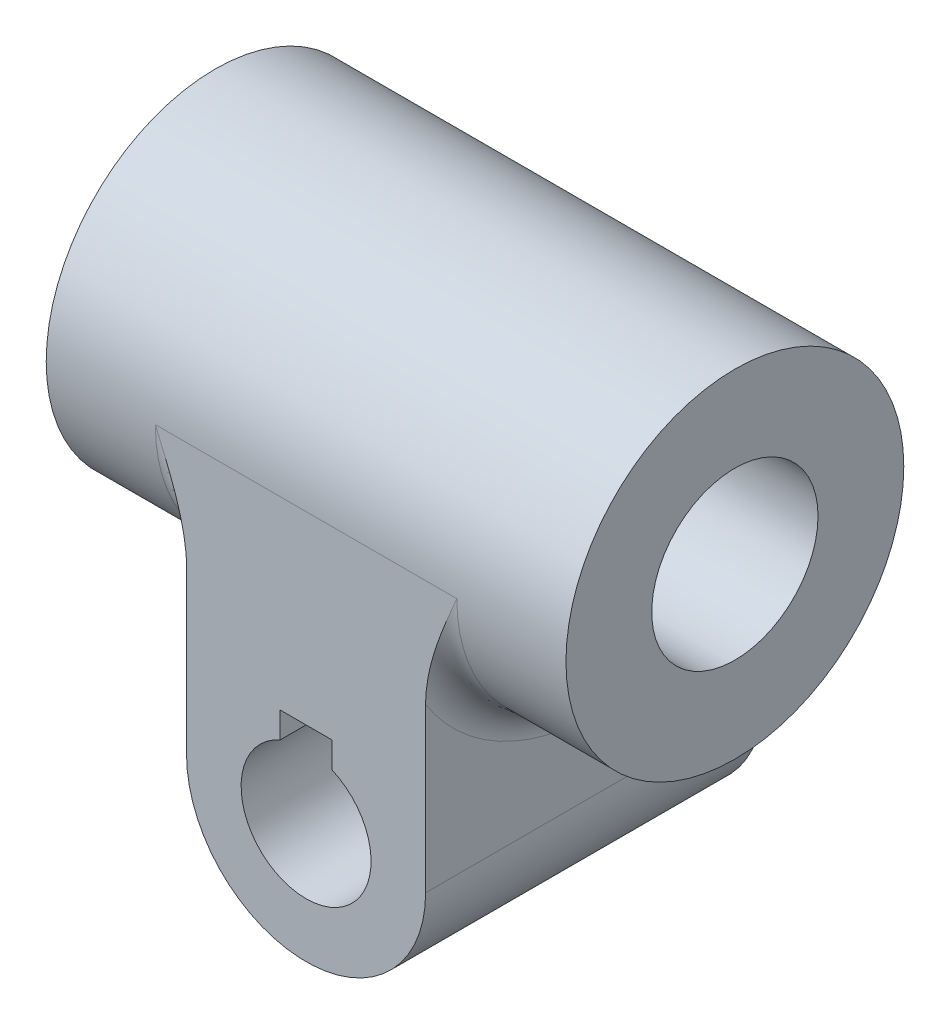
ISO-10303-21;
HEADER;
FILE_DESCRIPTION(('STEP AP214'),'2;1');
FILE_NAME('part.step','',(''),(''),'','','');
FILE_SCHEMA(('AUTOMOTIVE_DESIGN { 1 0 10303 214 1 1 1 1 }'));
ENDSEC;
DATA;
#1=APPLICATION_CONTEXT('core data for automotive mechanical design processes');
#2=APPLICATION_PROTOCOL_DEFINITION('international standard','automotive_design',2000,#1);
#3=PRODUCT_CONTEXT('',#1,'mechanical');
#4=PRODUCT('Part','Part','',(#3));
#5=PRODUCT_RELATED_PRODUCT_CATEGORY('part','',(#4));
#6=PRODUCT_DEFINITION_FORMATION('','',#4);
#7=PRODUCT_DEFINITION_CONTEXT('part definition',#1,'design');
#8=PRODUCT_DEFINITION('design','',#6,#7);
#9=PRODUCT_DEFINITION_SHAPE('','',#8);
#10=(LENGTH_UNIT() NAMED_UNIT(*) SI_UNIT(.MILLI.,.METRE.));
#11=(NAMED_UNIT(*) PLANE_ANGLE_UNIT() SI_UNIT($,.RADIAN.));
#12=(NAMED_UNIT(*) SI_UNIT($,.STERADIAN.) SOLID_ANGLE_UNIT());
#13=UNCERTAINTY_MEASURE_WITH_UNIT(LENGTH_MEASURE(1.E-05),#10,'distance_accuracy_value','');
#14=(GEOMETRIC_REPRESENTATION_CONTEXT(3) GLOBAL_UNCERTAINTY_ASSIGNED_CONTEXT((#13)) GLOBAL_UNIT_ASSIGNED_CONTEXT((#10,
#11,#12)) REPRESENTATION_CONTEXT('',''));
#15=CARTESIAN_POINT('',(0.,0.,0.));
#16=DIRECTION('',(0.,0.,1.));
#17=DIRECTION('',(1.,0.,0.));
#18=AXIS2_PLACEMENT_3D('',#15,#16,#17);
#19=CARTESIAN_POINT('',(23.,0.,32.5));
#20=DIRECTION('',(0.,0.,1.));
#21=DIRECTION('',(0.,-1.,0.));
#22=AXIS2_PLACEMENT_3D('',#19,#20,#21);
#23=PLANE('',#22);
#24=CARTESIAN_POINT('',(0.,-52.,32.5));
#25=DIRECTION('',(0.,0.,1.));
#26=DIRECTION('',(1.,0.,0.));
#27=AXIS2_PLACEMENT_3D('',#24,#25,#26);
#28=CIRCLE('',#27,12.5);
#29=CARTESIAN_POINT('',(-4.99999999999999,-40.5435607626104,32.5));
#30=VERTEX_POINT('',#29);
#31=CARTESIAN_POINT('',(5.,-40.5435607626104,32.5));
#32=VERTEX_POINT('',#31);
#33=EDGE_CURVE('E203',#30,#32,#28,.T.);
#34=ORIENTED_EDGE('',*,*,#33,.F.);
#35=DIRECTION('',(0.,-1.,0.));
#36=VECTOR('',#35,1.);
#37=CARTESIAN_POINT('',(-5.,0.,32.5));
#38=LINE('',#37,#36);
#39=CARTESIAN_POINT('',(-5.,-35.5435607626104,32.5));
#40=VERTEX_POINT('',#39);
#41=EDGE_CURVE('E205',#40,#30,#38,.T.);
#42=ORIENTED_EDGE('',*,*,#41,.F.);
#43=DIRECTION('',(-1.,0.,0.));
#44=VECTOR('',#43,1.);
#45=CARTESIAN_POINT('',(0.,-35.5435607626104,32.5));
#46=LINE('',#45,#44);
#47=CARTESIAN_POINT('',(5.,-35.5435607626104,32.5));
#48=VERTEX_POINT('',#47);
#49=EDGE_CURVE('E214',#48,#40,#46,.T.);
#50=ORIENTED_EDGE('',*,*,#49,.F.);
#51=DIRECTION('',(0.,1.,0.));
#52=VECTOR('',#51,1.);
#53=CARTESIAN_POINT('',(5.,0.,32.5));
#54=LINE('',#53,#52);
#55=EDGE_CURVE('E208',#32,#48,#54,.T.);
#56=ORIENTED_EDGE('',*,*,#55,.F.);
#57=EDGE_LOOP('',(#34,#42,#50,#56));
#58=FACE_BOUND('',#57,.T.);
#59=DIRECTION('',(0.,1.,0.));
#60=VECTOR('',#59,1.);
#61=CARTESIAN_POINT('',(-23.,0.,32.5));
#62=LINE('',#61,#60);
#63=CARTESIAN_POINT('',(-23.,-52.,32.5));
#64=VERTEX_POINT('',#63);
#65=CARTESIAN_POINT('',(-23.,-20.6397674405503,32.5));
#66=VERTEX_POINT('',#65);
#67=EDGE_CURVE('E235',#64,#66,#62,.T.);
#68=ORIENTED_EDGE('',*,*,#67,.F.);
#69=CARTESIAN_POINT('',(0.,-52.,32.5));
#70=DIRECTION('',(0.,0.,1.));
#71=DIRECTION('',(1.,0.,0.));
#72=AXIS2_PLACEMENT_3D('',#69,#70,#71);
#73=CIRCLE('',#72,23.);
#74=CARTESIAN_POINT('',(23.,-52.,32.5));
#75=VERTEX_POINT('',#74);
#76=EDGE_CURVE('E228',#64,#75,#73,.T.);
#77=ORIENTED_EDGE('',*,*,#76,.T.);
#78=DIRECTION('',(0.,1.,0.));
#79=VECTOR('',#78,1.);
#80=CARTESIAN_POINT('',(23.,0.,32.5));
#81=LINE('',#80,#79);
#82=CARTESIAN_POINT('',(23.,-20.6397674405503,32.5));
#83=VERTEX_POINT('',#82);
#84=EDGE_CURVE('E231',#75,#83,#81,.T.);
#85=ORIENTED_EDGE('',*,*,#84,.T.);
#86=CARTESIAN_POINT('',(23.,-20.6397674405503,32.5));
#87=CARTESIAN_POINT('',(23.0000034908473,-20.4440794758737,32.5));
#88=CARTESIAN_POINT('',(23.0027510394967,-20.2484068695015,32.5));
#89=CARTESIAN_POINT('',(23.0134267212858,-19.8572210250059,32.5));
#90=CARTESIAN_POINT('',(23.0213543428504,-19.6617077730538,32.5));
#91=CARTESIAN_POINT('',(23.0524339951041,-19.0757866306599,32.5));
#92=CARTESIAN_POINT('',(23.0828835907012,-18.6857521125174,32.5));
#93=CARTESIAN_POINT('',(23.1609585806695,-17.9085562648726,32.5));
#94=CARTESIAN_POINT('',(23.2085356307641,-17.5213899477842,32.5));
#95=CARTESIAN_POINT('',(23.3189999563839,-16.7492108789307,32.5));
#96=CARTESIAN_POINT('',(23.3818897273992,-16.3641984886603,32.5));
#97=CARTESIAN_POINT('',(23.5894956701399,-15.2209793695484,32.5));
#98=CARTESIAN_POINT('',(23.7540522417134,-14.4663488189222,32.5));
#99=CARTESIAN_POINT('',(24.1254467042139,-12.9671768959918,32.5));
#100=CARTESIAN_POINT('',(24.3323192834023,-12.2226443388064,32.5));
#101=CARTESIAN_POINT('',(24.7036385258611,-10.99382107014,32.5));
#102=CARTESIAN_POINT('',(24.8587723250938,-10.5066740880603,32.5));
#103=CARTESIAN_POINT('',(25.181300472027,-9.5364486932576,32.5));
#104=CARTESIAN_POINT('',(25.3486952223336,-9.05337041471758,32.5));
#105=CARTESIAN_POINT('',(25.8660313356109,-7.60978875922743,32.5));
#106=CARTESIAN_POINT('',(26.2311831849828,-6.65475035892813,32.5));
#107=CARTESIAN_POINT('',(26.9881773284552,-4.7525889230039,32.5));
#108=CARTESIAN_POINT('',(27.380087528536,-3.80549343398627,32.5));
#109=CARTESIAN_POINT('',(28.1765655154986,-1.91662872704472,32.5));
#110=CARTESIAN_POINT('',(28.581133973659,-0.974859794730516,32.5));
#111=CARTESIAN_POINT('',(28.9905108867818,-0.0220847108905423,32.5));
#112=CARTESIAN_POINT('',(28.9952554440396,-0.011042355094019,32.5));
#113=CARTESIAN_POINT('',(29.,0.,32.5));
#114=B_SPLINE_CURVE_WITH_KNOTS('',3,(#86,#87,#88,#89,#90,#91,#92,#93,#94,#95,#96,#97,#98,#99,
#100,#101,#102,#103,#104,#105,#106,#107,#108,#109,#110,#111,#112,#113),.UNSPECIFIED.,.F.,.F.,(4,
2,2,2,2,2,2,2,2,2,2,2,2,4),(0.,0.587018887534861,1.1739798108562,2.3471668108179,
3.51706798664066,4.68715994718502,7.00253143611865,9.31980859674453,10.853397347038,
12.3870364775474,15.4537239311552,18.5285059743827,21.6034513532848,21.6395068660702),.UNSPECIFIED.);
#115=CARTESIAN_POINT('',(29.,0.,32.5));
#116=VERTEX_POINT('',#115);
#117=EDGE_CURVE('E12',#83,#116,#114,.T.);
#118=ORIENTED_EDGE('',*,*,#117,.T.);
#119=DIRECTION('',(-1.,0.,0.));
#120=VECTOR('',#119,1.);
#121=CARTESIAN_POINT('',(23.,0.,32.5));
#122=LINE('',#121,#120);
#123=CARTESIAN_POINT('',(-29.,0.,32.5));
#124=VERTEX_POINT('',#123);
#125=EDGE_CURVE('E242',#116,#124,#122,.T.);
#126=ORIENTED_EDGE('',*,*,#125,.T.);
#127=CARTESIAN_POINT('',(-23.,-20.6397674405503,32.5));
#128=CARTESIAN_POINT('',(-23.0000034908473,-20.4440794758737,32.5));
#129=CARTESIAN_POINT('',(-23.0027510394967,-20.2484068695015,32.5));
#130=CARTESIAN_POINT('',(-23.0134267212858,-19.8572210250059,32.5));
#131=CARTESIAN_POINT('',(-23.0213543428504,-19.6617077730538,32.5));
#132=CARTESIAN_POINT('',(-23.0524339951041,-19.0757866306599,32.5));
#133=CARTESIAN_POINT('',(-23.0828835907012,-18.6857521125174,32.5));
#134=CARTESIAN_POINT('',(-23.1609585806695,-17.9085562648726,32.5));
#135=CARTESIAN_POINT('',(-23.2085356307641,-17.5213899477842,32.5));
#136=CARTESIAN_POINT('',(-23.3189999563839,-16.7492108789307,32.5));
#137=CARTESIAN_POINT('',(-23.3818897273992,-16.3641984886603,32.5));
#138=CARTESIAN_POINT('',(-23.5894956701399,-15.2209793695484,32.5));
#139=CARTESIAN_POINT('',(-23.7540522417134,-14.4663488189222,32.5));
#140=CARTESIAN_POINT('',(-24.1254467042139,-12.9671768959918,32.5));
#141=CARTESIAN_POINT('',(-24.3323192834023,-12.2226443388064,32.5));
#142=CARTESIAN_POINT('',(-24.7036385258611,-10.99382107014,32.5));
#143=CARTESIAN_POINT('',(-24.8587723250938,-10.5066740880603,32.5));
#144=CARTESIAN_POINT('',(-25.181300472027,-9.5364486932576,32.5));
#145=CARTESIAN_POINT('',(-25.3486952223336,-9.05337041471758,32.5));
#146=CARTESIAN_POINT('',(-25.8660313356109,-7.60978875922743,32.5));
#147=CARTESIAN_POINT('',(-26.2311831849828,-6.65475035892813,32.5));
#148=CARTESIAN_POINT('',(-26.9881773284552,-4.7525889230039,32.5));
#149=CARTESIAN_POINT('',(-27.380087528536,-3.80549343398627,32.5));
#150=CARTESIAN_POINT('',(-28.1765655154986,-1.91662872704472,32.5));
#151=CARTESIAN_POINT('',(-28.581133973659,-0.974859794730516,32.5));
#152=CARTESIAN_POINT('',(-28.9905108867818,-0.0220847108905423,32.5));
#153=CARTESIAN_POINT('',(-28.9952554440396,-0.011042355094019,32.5));
#154=CARTESIAN_POINT('',(-29.,0.,32.5));
#155=B_SPLINE_CURVE_WITH_KNOTS('',3,(#127,#128,#129,#130,#131,#132,#133,#134,#135,#136,#137,
#138,#139,#140,#141,#142,#143,#144,#145,#146,#147,#148,#149,#150,#151,#152,#153,#154),
.UNSPECIFIED.,.F.,.F.,(4,2,2,2,2,2,2,2,2,2,2,2,2,4),(0.,0.587018887534861,1.1739798108562,
2.3471668108179,3.51706798664066,4.68715994718502,7.00253143611865,9.31980859674453,
10.853397347038,12.3870364775474,15.4537239311552,18.5285059743827,21.6034513532848,
21.6395068660702),.UNSPECIFIED.);
#156=EDGE_CURVE('E280',#124,#66,#155,.F.);
#157=ORIENTED_EDGE('',*,*,#156,.T.);
#158=EDGE_LOOP('',(#68,#77,#85,#118,#126,#157));
#159=FACE_BOUND('',#158,.T.);
#160=ADVANCED_FACE('F97',(#58,#159),#23,.T.);
#161=CARTESIAN_POINT('',(50.,0.,0.));
#162=DIRECTION('',(-1.,0.,0.));
#163=DIRECTION('',(0.,0.,1.));
#164=AXIS2_PLACEMENT_3D('',#161,#162,#163);
#165=CYLINDRICAL_SURFACE('',#164,32.5);
#166=CARTESIAN_POINT('',(-50.,0.,0.));
#167=DIRECTION('',(1.,0.,0.));
#168=DIRECTION('',(0.,0.,-1.));
#169=AXIS2_PLACEMENT_3D('',#166,#167,#168);
#170=CIRCLE('',#169,32.5);
#171=CARTESIAN_POINT('',(-50.,0.,-32.5));
#172=VERTEX_POINT('',#171);
#173=EDGE_CURVE('E252',#172,#172,#170,.T.);
#174=ORIENTED_EDGE('',*,*,#173,.T.);
#175=EDGE_LOOP('',(#174));
#176=FACE_BOUND('',#175,.T.);
#177=CARTESIAN_POINT('',(50.,0.,0.));
#178=DIRECTION('',(1.,0.,0.));
#179=DIRECTION('',(0.,0.,-1.));
#180=AXIS2_PLACEMENT_3D('',#177,#178,#179);
#181=CIRCLE('',#180,32.5);
#182=CARTESIAN_POINT('',(50.,0.,-32.5));
#183=VERTEX_POINT('',#182);
#184=EDGE_CURVE('E253',#183,#183,#181,.T.);
#185=ORIENTED_EDGE('',*,*,#184,.F.);
#186=EDGE_LOOP('',(#185));
#187=FACE_BOUND('',#186,.T.);
#188=DIRECTION('',(-1.,0.,0.));
#189=VECTOR('',#188,1.);
#190=CARTESIAN_POINT('',(23.,0.,-32.5));
#191=LINE('',#190,#189);
#192=CARTESIAN_POINT('',(29.,0.,-32.5));
#193=VERTEX_POINT('',#192);
#194=CARTESIAN_POINT('',(-29.,0.,-32.5));
#195=VERTEX_POINT('',#194);
#196=EDGE_CURVE('E238',#193,#195,#191,.T.);
#197=ORIENTED_EDGE('',*,*,#196,.T.);
#198=CARTESIAN_POINT('',(-29.,0.,0.));
#199=DIRECTION('',(1.,0.,0.));
#200=DIRECTION('',(0.,0.,-1.));
#201=AXIS2_PLACEMENT_3D('',#198,#199,#200);
#202=CIRCLE('',#201,32.5);
#203=EDGE_CURVE('E264',#195,#124,#202,.F.);
#204=ORIENTED_EDGE('',*,*,#203,.T.);
#205=ORIENTED_EDGE('',*,*,#125,.F.);
#206=CARTESIAN_POINT('',(29.,0.,0.));
#207=DIRECTION('',(1.,0.,0.));
#208=DIRECTION('',(0.,0.,-1.));
#209=AXIS2_PLACEMENT_3D('',#206,#207,#208);
#210=CIRCLE('',#209,32.5);
#211=EDGE_CURVE('E265',#116,#193,#210,.T.);
#212=ORIENTED_EDGE('',*,*,#211,.T.);
#213=EDGE_LOOP('',(#197,#204,#205,#212));
#214=FACE_BOUND('',#213,.T.);
#215=ADVANCED_FACE('F316',(#176,#187,#214),#165,.T.);
#216=CARTESIAN_POINT('',(50.,0.,0.));
#217=DIRECTION('',(-1.,0.,0.));
#218=DIRECTION('',(0.,0.,1.));
#219=AXIS2_PLACEMENT_3D('',#216,#217,#218);
#220=CYLINDRICAL_SURFACE('',#219,16.);
#221=CARTESIAN_POINT('',(50.,0.,0.));
#222=DIRECTION('',(1.,0.,0.));
#223=DIRECTION('',(0.,0.,-1.));
#224=AXIS2_PLACEMENT_3D('',#221,#222,#223);
#225=CIRCLE('',#224,16.);
#226=CARTESIAN_POINT('',(50.,0.,-16.));
#227=VERTEX_POINT('',#226);
#228=EDGE_CURVE('E247',#227,#227,#225,.T.);
#229=ORIENTED_EDGE('',*,*,#228,.T.);
#230=EDGE_LOOP('',(#229));
#231=FACE_BOUND('',#230,.T.);
#232=CARTESIAN_POINT('',(-50.,0.,0.));
#233=DIRECTION('',(1.,0.,0.));
#234=DIRECTION('',(0.,0.,-1.));
#235=AXIS2_PLACEMENT_3D('',#232,#233,#234);
#236=CIRCLE('',#235,16.);
#237=CARTESIAN_POINT('',(-50.,0.,-16.));
#238=VERTEX_POINT('',#237);
#239=EDGE_CURVE('E249',#238,#238,#236,.T.);
#240=ORIENTED_EDGE('',*,*,#239,.F.);
#241=EDGE_LOOP('',(#240));
#242=FACE_BOUND('',#241,.T.);
#243=ADVANCED_FACE('F318',(#231,#242),#220,.F.);
#244=CARTESIAN_POINT('',(50.,0.,0.));
#245=DIRECTION('',(1.,0.,0.));
#246=DIRECTION('',(0.,0.,-1.));
#247=AXIS2_PLACEMENT_3D('',#244,#245,#246);
#248=PLANE('',#247);
#249=ORIENTED_EDGE('',*,*,#228,.F.);
#250=EDGE_LOOP('',(#249));
#251=FACE_BOUND('',#250,.T.);
#252=ORIENTED_EDGE('',*,*,#184,.T.);
#253=EDGE_LOOP('',(#252));
#254=FACE_BOUND('',#253,.T.);
#255=ADVANCED_FACE('F324',(#251,#254),#248,.T.);
#256=CARTESIAN_POINT('',(-50.,0.,0.));
#257=DIRECTION('',(1.,0.,0.));
#258=DIRECTION('',(0.,0.,-1.));
#259=AXIS2_PLACEMENT_3D('',#256,#257,#258);
#260=PLANE('',#259);
#261=ORIENTED_EDGE('',*,*,#239,.T.);
#262=EDGE_LOOP('',(#261));
#263=FACE_BOUND('',#262,.T.);
#264=ORIENTED_EDGE('',*,*,#173,.F.);
#265=EDGE_LOOP('',(#264));
#266=FACE_BOUND('',#265,.T.);
#267=ADVANCED_FACE('F290',(#263,#266),#260,.F.);
#268=CARTESIAN_POINT('',(23.,0.,-32.5));
#269=DIRECTION('',(0.,0.,-1.));
#270=DIRECTION('',(0.,1.,0.));
#271=AXIS2_PLACEMENT_3D('',#268,#269,#270);
#272=PLANE('',#271);
#273=CARTESIAN_POINT('',(0.,-52.,-32.5));
#274=DIRECTION('',(0.,0.,-1.));
#275=DIRECTION('',(0.,1.,0.));
#276=AXIS2_PLACEMENT_3D('',#273,#274,#275);
#277=CIRCLE('',#276,23.);
#278=CARTESIAN_POINT('',(-23.,-52.,-32.5));
#279=VERTEX_POINT('',#278);
#280=CARTESIAN_POINT('',(23.,-52.,-32.5));
#281=VERTEX_POINT('',#280);
#282=EDGE_CURVE('E229',#279,#281,#277,.F.);
#283=ORIENTED_EDGE('',*,*,#282,.F.);
#284=DIRECTION('',(0.,-1.,0.));
#285=VECTOR('',#284,1.);
#286=CARTESIAN_POINT('',(-23.,0.,-32.5));
#287=LINE('',#286,#285);
#288=CARTESIAN_POINT('',(-23.,-20.6397674405503,-32.5));
#289=VERTEX_POINT('',#288);
#290=EDGE_CURVE('E236',#289,#279,#287,.T.);
#291=ORIENTED_EDGE('',*,*,#290,.F.);
#292=CARTESIAN_POINT('',(-23.,-20.6397674405503,-32.5));
#293=CARTESIAN_POINT('',(-23.0000034908473,-20.4440794758737,-32.5));
#294=CARTESIAN_POINT('',(-23.0027510394967,-20.2484068695015,-32.5));
#295=CARTESIAN_POINT('',(-23.0134267212858,-19.8572210250059,-32.5));
#296=CARTESIAN_POINT('',(-23.0213543428504,-19.6617077730538,-32.5));
#297=CARTESIAN_POINT('',(-23.0524339951041,-19.0757866306599,-32.5));
#298=CARTESIAN_POINT('',(-23.0828835907012,-18.6857521125174,-32.5));
#299=CARTESIAN_POINT('',(-23.1609585806695,-17.9085562648726,-32.5));
#300=CARTESIAN_POINT('',(-23.2085356307641,-17.5213899477842,-32.5));
#301=CARTESIAN_POINT('',(-23.3189999563839,-16.7492108789307,-32.5));
#302=CARTESIAN_POINT('',(-23.3818897273992,-16.3641984886603,-32.5));
#303=CARTESIAN_POINT('',(-23.5894956701399,-15.2209793695484,-32.5));
#304=CARTESIAN_POINT('',(-23.7540522417134,-14.4663488189222,-32.5));
#305=CARTESIAN_POINT('',(-24.1254467042139,-12.9671768959918,-32.5));
#306=CARTESIAN_POINT('',(-24.3323192834023,-12.2226443388064,-32.5));
#307=CARTESIAN_POINT('',(-24.7036385258611,-10.99382107014,-32.5));
#308=CARTESIAN_POINT('',(-24.8587723250938,-10.5066740880603,-32.5));
#309=CARTESIAN_POINT('',(-25.181300472027,-9.5364486932576,-32.5));
#310=CARTESIAN_POINT('',(-25.3486952223336,-9.05337041471758,-32.5));
#311=CARTESIAN_POINT('',(-25.8660313356109,-7.60978875922743,-32.5));
#312=CARTESIAN_POINT('',(-26.2311831849828,-6.65475035892813,-32.5));
#313=CARTESIAN_POINT('',(-26.9881773284552,-4.7525889230039,-32.5));
#314=CARTESIAN_POINT('',(-27.380087528536,-3.80549343398627,-32.5));
#315=CARTESIAN_POINT('',(-28.1765655154986,-1.91662872704472,-32.5));
#316=CARTESIAN_POINT('',(-28.581133973659,-0.974859794730516,-32.5));
#317=CARTESIAN_POINT('',(-28.9905108867818,-0.0220847108905423,-32.5));
#318=CARTESIAN_POINT('',(-28.9952554440396,-0.011042355094019,-32.5));
#319=CARTESIAN_POINT('',(-29.,0.,-32.5));
#320=B_SPLINE_CURVE_WITH_KNOTS('',3,(#292,#293,#294,#295,#296,#297,#298,#299,#300,#301,#302,
#303,#304,#305,#306,#307,#308,#309,#310,#311,#312,#313,#314,#315,#316,#317,#318,#319),
.UNSPECIFIED.,.F.,.F.,(4,2,2,2,2,2,2,2,2,2,2,2,2,4),(0.,0.587018887534861,1.1739798108562,
2.3471668108179,3.51706798664066,4.68715994718502,7.00253143611865,9.31980859674453,
10.853397347038,12.3870364775474,15.4537239311552,18.5285059743827,21.6034513532848,
21.6395068660702),.UNSPECIFIED.);
#321=EDGE_CURVE('E267',#289,#195,#320,.T.);
#322=ORIENTED_EDGE('',*,*,#321,.T.);
#323=ORIENTED_EDGE('',*,*,#196,.F.);
#324=CARTESIAN_POINT('',(23.,-20.6397674405503,-32.5));
#325=CARTESIAN_POINT('',(23.0000034908473,-20.4440794758737,-32.5));
#326=CARTESIAN_POINT('',(23.0027510394967,-20.2484068695015,-32.5));
#327=CARTESIAN_POINT('',(23.0134267212858,-19.8572210250059,-32.5));
#328=CARTESIAN_POINT('',(23.0213543428504,-19.6617077730538,-32.5));
#329=CARTESIAN_POINT('',(23.0524339951041,-19.0757866306599,-32.5));
#330=CARTESIAN_POINT('',(23.0828835907012,-18.6857521125174,-32.5));
#331=CARTESIAN_POINT('',(23.1609585806695,-17.9085562648726,-32.5));
#332=CARTESIAN_POINT('',(23.2085356307641,-17.5213899477842,-32.5));
#333=CARTESIAN_POINT('',(23.3189999563839,-16.7492108789307,-32.5));
#334=CARTESIAN_POINT('',(23.3818897273992,-16.3641984886603,-32.5));
#335=CARTESIAN_POINT('',(23.5894956701399,-15.2209793695484,-32.5));
#336=CARTESIAN_POINT('',(23.7540522417134,-14.4663488189222,-32.5));
#337=CARTESIAN_POINT('',(24.1254467042139,-12.9671768959918,-32.5));
#338=CARTESIAN_POINT('',(24.3323192834023,-12.2226443388064,-32.5));
#339=CARTESIAN_POINT('',(24.7036385258611,-10.99382107014,-32.5));
#340=CARTESIAN_POINT('',(24.8587723250938,-10.5066740880603,-32.5));
#341=CARTESIAN_POINT('',(25.181300472027,-9.5364486932576,-32.5));
#342=CARTESIAN_POINT('',(25.3486952223336,-9.05337041471758,-32.5));
#343=CARTESIAN_POINT('',(25.8660313356109,-7.60978875922743,-32.5));
#344=CARTESIAN_POINT('',(26.2311831849828,-6.65475035892813,-32.5));
#345=CARTESIAN_POINT('',(26.9881773284552,-4.7525889230039,-32.5));
#346=CARTESIAN_POINT('',(27.380087528536,-3.80549343398627,-32.5));
#347=CARTESIAN_POINT('',(28.1765655154986,-1.91662872704472,-32.5));
#348=CARTESIAN_POINT('',(28.581133973659,-0.974859794730516,-32.5));
#349=CARTESIAN_POINT('',(28.9905108867818,-0.0220847108905423,-32.5));
#350=CARTESIAN_POINT('',(28.9952554440396,-0.011042355094019,-32.5));
#351=CARTESIAN_POINT('',(29.,0.,-32.5));
#352=B_SPLINE_CURVE_WITH_KNOTS('',3,(#324,#325,#326,#327,#328,#329,#330,#331,#332,#333,#334,
#335,#336,#337,#338,#339,#340,#341,#342,#343,#344,#345,#346,#347,#348,#349,#350,#351),
.UNSPECIFIED.,.F.,.F.,(4,2,2,2,2,2,2,2,2,2,2,2,2,4),(0.,0.587018887534861,1.1739798108562,
2.3471668108179,3.51706798664066,4.68715994718502,7.00253143611865,9.31980859674453,
10.853397347038,12.3870364775474,15.4537239311552,18.5285059743827,21.6034513532848,
21.6395068660702),.UNSPECIFIED.);
#353=CARTESIAN_POINT('',(23.,-20.6397674405503,-32.5));
#354=VERTEX_POINT('',#353);
#355=EDGE_CURVE('E114',#193,#354,#352,.F.);
#356=ORIENTED_EDGE('',*,*,#355,.T.);
#357=DIRECTION('',(0.,-1.,0.));
#358=VECTOR('',#357,1.);
#359=CARTESIAN_POINT('',(23.,0.,-32.5));
#360=LINE('',#359,#358);
#361=EDGE_CURVE('E240',#354,#281,#360,.T.);
#362=ORIENTED_EDGE('',*,*,#361,.T.);
#363=EDGE_LOOP('',(#283,#291,#322,#323,#356,#362));
#364=FACE_BOUND('',#363,.T.);
#365=CARTESIAN_POINT('',(0.,-52.,-32.5));
#366=DIRECTION('',(0.,0.,-1.));
#367=DIRECTION('',(0.,1.,0.));
#368=AXIS2_PLACEMENT_3D('',#365,#366,#367);
#369=CIRCLE('',#368,12.5);
#370=CARTESIAN_POINT('',(-4.99999999999999,-40.5435607626104,-32.5));
#371=VERTEX_POINT('',#370);
#372=CARTESIAN_POINT('',(5.00000000000001,-40.5435607626104,-32.5));
#373=VERTEX_POINT('',#372);
#374=EDGE_CURVE('E196',#371,#373,#369,.F.);
#375=ORIENTED_EDGE('',*,*,#374,.T.);
#376=DIRECTION('',(0.,1.,0.));
#377=VECTOR('',#376,1.);
#378=CARTESIAN_POINT('',(5.,0.,-32.5));
#379=LINE('',#378,#377);
#380=CARTESIAN_POINT('',(5.,-35.5435607626104,-32.5));
#381=VERTEX_POINT('',#380);
#382=EDGE_CURVE('E185',#373,#381,#379,.T.);
#383=ORIENTED_EDGE('',*,*,#382,.T.);
#384=DIRECTION('',(-1.,0.,0.));
#385=VECTOR('',#384,1.);
#386=CARTESIAN_POINT('',(0.,-35.5435607626104,-32.5));
#387=LINE('',#386,#385);
#388=CARTESIAN_POINT('',(-5.,-35.5435607626104,-32.5));
#389=VERTEX_POINT('',#388);
#390=EDGE_CURVE('E209',#381,#389,#387,.T.);
#391=ORIENTED_EDGE('',*,*,#390,.T.);
#392=DIRECTION('',(0.,-1.,0.));
#393=VECTOR('',#392,1.);
#394=CARTESIAN_POINT('',(-5.,0.,-32.5));
#395=LINE('',#394,#393);
#396=EDGE_CURVE('E206',#389,#371,#395,.T.);
#397=ORIENTED_EDGE('',*,*,#396,.T.);
#398=EDGE_LOOP('',(#375,#383,#391,#397));
#399=FACE_BOUND('',#398,.T.);
#400=ADVANCED_FACE('F202',(#364,#399),#272,.T.);
#401=CARTESIAN_POINT('',(23.,0.,0.));
#402=DIRECTION('',(1.,0.,0.));
#403=DIRECTION('',(0.,0.,-1.));
#404=AXIS2_PLACEMENT_3D('',#401,#402,#403);
#405=PLANE('',#404);
#406=ORIENTED_EDGE('',*,*,#361,.F.);
#407=CARTESIAN_POINT('',(23.,0.,0.));
#408=DIRECTION('',(1.,0.,0.));
#409=DIRECTION('',(0.,0.,-1.));
#410=AXIS2_PLACEMENT_3D('',#407,#408,#409);
#411=CIRCLE('',#410,38.5);
#412=EDGE_CURVE('E117',#354,#83,#411,.F.);
#413=ORIENTED_EDGE('',*,*,#412,.T.);
#414=ORIENTED_EDGE('',*,*,#84,.F.);
#415=DIRECTION('',(0.,0.,1.));
#416=VECTOR('',#415,1.);
#417=CARTESIAN_POINT('',(23.,-52.,-32.501));
#418=LINE('',#417,#416);
#419=EDGE_CURVE('E234',#281,#75,#418,.T.);
#420=ORIENTED_EDGE('',*,*,#419,.F.);
#421=EDGE_LOOP('',(#406,#413,#414,#420));
#422=FACE_BOUND('',#421,.T.);
#423=ADVANCED_FACE('F287',(#422),#405,.T.);
#424=CARTESIAN_POINT('',(-23.,0.,0.));
#425=DIRECTION('',(1.,0.,0.));
#426=DIRECTION('',(0.,0.,-1.));
#427=AXIS2_PLACEMENT_3D('',#424,#425,#426);
#428=PLANE('',#427);
#429=ORIENTED_EDGE('',*,*,#67,.T.);
#430=CARTESIAN_POINT('',(-23.,0.,0.));
#431=DIRECTION('',(1.,0.,0.));
#432=DIRECTION('',(0.,0.,-1.));
#433=AXIS2_PLACEMENT_3D('',#430,#431,#432);
#434=CIRCLE('',#433,38.5);
#435=EDGE_CURVE('E254',#66,#289,#434,.T.);
#436=ORIENTED_EDGE('',*,*,#435,.T.);
#437=ORIENTED_EDGE('',*,*,#290,.T.);
#438=DIRECTION('',(0.,0.,1.));
#439=VECTOR('',#438,1.);
#440=CARTESIAN_POINT('',(-23.,-52.,-32.501));
#441=LINE('',#440,#439);
#442=EDGE_CURVE('E192',#279,#64,#441,.T.);
#443=ORIENTED_EDGE('',*,*,#442,.T.);
#444=EDGE_LOOP('',(#429,#436,#437,#443));
#445=FACE_BOUND('',#444,.T.);
#446=ADVANCED_FACE('F286',(#445),#428,.F.);
#447=CARTESIAN_POINT('',(0.,-52.,-32.501));
#448=DIRECTION('',(0.,0.,1.));
#449=DIRECTION('',(1.,0.,0.));
#450=AXIS2_PLACEMENT_3D('',#447,#448,#449);
#451=CYLINDRICAL_SURFACE('',#450,23.);
#452=ORIENTED_EDGE('',*,*,#282,.T.);
#453=ORIENTED_EDGE('',*,*,#419,.T.);
#454=ORIENTED_EDGE('',*,*,#76,.F.);
#455=ORIENTED_EDGE('',*,*,#442,.F.);
#456=EDGE_LOOP('',(#452,#453,#454,#455));
#457=FACE_BOUND('',#456,.T.);
#458=ADVANCED_FACE('F313',(#457),#451,.T.);
#459=CARTESIAN_POINT('',(0.,-52.,-32.501));
#460=DIRECTION('',(0.,0.,1.));
#461=DIRECTION('',(1.,0.,0.));
#462=AXIS2_PLACEMENT_3D('',#459,#460,#461);
#463=CYLINDRICAL_SURFACE('',#462,12.5);
#464=DIRECTION('',(0.,0.,1.));
#465=VECTOR('',#464,1.);
#466=CARTESIAN_POINT('',(-4.99999999999999,-40.5435607626104,-32.501));
#467=LINE('',#466,#465);
#468=EDGE_CURVE('E195',#371,#30,#467,.T.);
#469=ORIENTED_EDGE('',*,*,#468,.T.);
#470=ORIENTED_EDGE('',*,*,#33,.T.);
#471=DIRECTION('',(0.,0.,1.));
#472=VECTOR('',#471,1.);
#473=CARTESIAN_POINT('',(5.00000000000001,-40.5435607626104,-32.501));
#474=LINE('',#473,#472);
#475=EDGE_CURVE('E189',#373,#32,#474,.T.);
#476=ORIENTED_EDGE('',*,*,#475,.F.);
#477=ORIENTED_EDGE('',*,*,#374,.F.);
#478=EDGE_LOOP('',(#469,#470,#476,#477));
#479=FACE_BOUND('',#478,.T.);
#480=ADVANCED_FACE('F197',(#479),#463,.F.);
#481=CARTESIAN_POINT('',(-5.,0.,-32.501));
#482=DIRECTION('',(-1.,0.,0.));
#483=DIRECTION('',(0.,-1.,0.));
#484=AXIS2_PLACEMENT_3D('',#481,#482,#483);
#485=PLANE('',#484);
#486=DIRECTION('',(0.,0.,1.));
#487=VECTOR('',#486,1.);
#488=CARTESIAN_POINT('',(-5.,-35.5435607626104,-32.501));
#489=LINE('',#488,#487);
#490=EDGE_CURVE('E222',#389,#40,#489,.T.);
#491=ORIENTED_EDGE('',*,*,#490,.T.);
#492=ORIENTED_EDGE('',*,*,#41,.T.);
#493=ORIENTED_EDGE('',*,*,#468,.F.);
#494=ORIENTED_EDGE('',*,*,#396,.F.);
#495=EDGE_LOOP('',(#491,#492,#493,#494));
#496=FACE_BOUND('',#495,.T.);
#497=ADVANCED_FACE('F364',(#496),#485,.F.);
#498=CARTESIAN_POINT('',(0.,-35.5435607626104,-32.501));
#499=DIRECTION('',(0.,1.,0.));
#500=DIRECTION('',(0.,0.,1.));
#501=AXIS2_PLACEMENT_3D('',#498,#499,#500);
#502=PLANE('',#501);
#503=DIRECTION('',(0.,0.,1.));
#504=VECTOR('',#503,1.);
#505=CARTESIAN_POINT('',(5.,-35.5435607626104,-32.501));
#506=LINE('',#505,#504);
#507=EDGE_CURVE('E190',#381,#48,#506,.T.);
#508=ORIENTED_EDGE('',*,*,#507,.T.);
#509=ORIENTED_EDGE('',*,*,#49,.T.);
#510=ORIENTED_EDGE('',*,*,#490,.F.);
#511=ORIENTED_EDGE('',*,*,#390,.F.);
#512=EDGE_LOOP('',(#508,#509,#510,#511));
#513=FACE_BOUND('',#512,.T.);
#514=ADVANCED_FACE('F373',(#513),#502,.F.);
#515=CARTESIAN_POINT('',(5.,0.,-32.501));
#516=DIRECTION('',(1.,0.,0.));
#517=DIRECTION('',(0.,1.,0.));
#518=AXIS2_PLACEMENT_3D('',#515,#516,#517);
#519=PLANE('',#518);
#520=ORIENTED_EDGE('',*,*,#475,.T.);
#521=ORIENTED_EDGE('',*,*,#55,.T.);
#522=ORIENTED_EDGE('',*,*,#507,.F.);
#523=ORIENTED_EDGE('',*,*,#382,.F.);
#524=EDGE_LOOP('',(#520,#521,#522,#523));
#525=FACE_BOUND('',#524,.T.);
#526=ADVANCED_FACE('F184',(#525),#519,.F.);
#527=CARTESIAN_POINT('',(-29.,0.,0.));
#528=DIRECTION('',(1.,0.,0.));
#529=DIRECTION('',(0.,0.,-1.));
#530=AXIS2_PLACEMENT_3D('',#527,#528,#529);
#531=TOROIDAL_SURFACE('',#530,38.5,6.);
#532=ORIENTED_EDGE('',*,*,#156,.F.);
#533=ORIENTED_EDGE('',*,*,#203,.F.);
#534=ORIENTED_EDGE('',*,*,#321,.F.);
#535=ORIENTED_EDGE('',*,*,#435,.F.);
#536=EDGE_LOOP('',(#532,#533,#534,#535));
#537=FACE_BOUND('',#536,.T.);
#538=ADVANCED_FACE('F281',(#537),#531,.F.);
#539=CARTESIAN_POINT('',(29.,0.,0.));
#540=DIRECTION('',(1.,0.,0.));
#541=DIRECTION('',(0.,0.,-1.));
#542=AXIS2_PLACEMENT_3D('',#539,#540,#541);
#543=TOROIDAL_SURFACE('',#542,38.5,6.);
#544=ORIENTED_EDGE('',*,*,#117,.F.);
#545=ORIENTED_EDGE('',*,*,#412,.F.);
#546=ORIENTED_EDGE('',*,*,#355,.F.);
#547=ORIENTED_EDGE('',*,*,#211,.F.);
#548=EDGE_LOOP('',(#544,#545,#546,#547));
#549=FACE_BOUND('',#548,.T.);
#550=ADVANCED_FACE('F101',(#549),#543,.F.);
#551=CLOSED_SHELL('',(#160,#215,#243,#255,#267,#400,#423,#446,#458,#480,#497,#514,#526,#538,#550));
#552=MANIFOLD_SOLID_BREP('B2',#551);
#553=ADVANCED_BREP_SHAPE_REPRESENTATION('',(#18,#552),#14);
#554=SHAPE_DEFINITION_REPRESENTATION(#9,#553);
ENDSEC;
END-ISO-10303-21;
